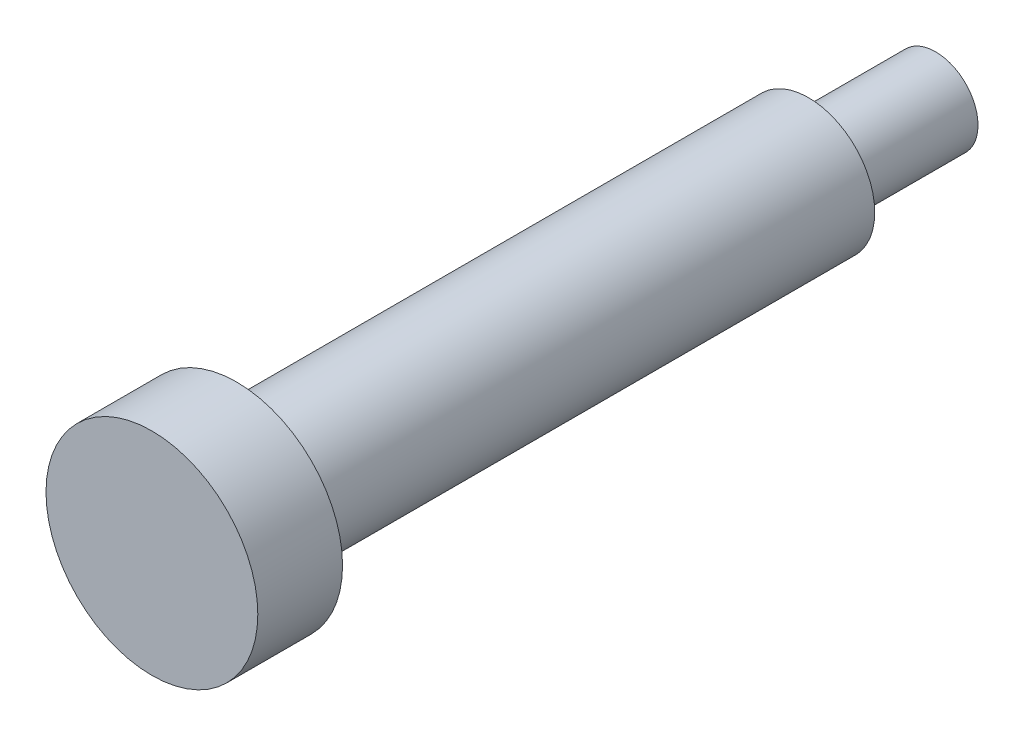
ISO-10303-21;
HEADER;
FILE_DESCRIPTION(('STEP AP214'),'2;1');
FILE_NAME('part.step','',(''),(''),'','','');
FILE_SCHEMA(('AUTOMOTIVE_DESIGN { 1 0 10303 214 1 1 1 1 }'));
ENDSEC;
DATA;
#1=APPLICATION_CONTEXT('core data for automotive mechanical design processes');
#2=APPLICATION_PROTOCOL_DEFINITION('international standard','automotive_design',2000,#1);
#3=PRODUCT_CONTEXT('',#1,'mechanical');
#4=PRODUCT('Part','Part','',(#3));
#5=PRODUCT_RELATED_PRODUCT_CATEGORY('part','',(#4));
#6=PRODUCT_DEFINITION_FORMATION('','',#4);
#7=PRODUCT_DEFINITION_CONTEXT('part definition',#1,'design');
#8=PRODUCT_DEFINITION('design','',#6,#7);
#9=PRODUCT_DEFINITION_SHAPE('','',#8);
#10=(LENGTH_UNIT() NAMED_UNIT(*) SI_UNIT(.MILLI.,.METRE.));
#11=(NAMED_UNIT(*) PLANE_ANGLE_UNIT() SI_UNIT($,.RADIAN.));
#12=(NAMED_UNIT(*) SI_UNIT($,.STERADIAN.) SOLID_ANGLE_UNIT());
#13=UNCERTAINTY_MEASURE_WITH_UNIT(LENGTH_MEASURE(1.E-05),#10,'distance_accuracy_value','');
#14=(GEOMETRIC_REPRESENTATION_CONTEXT(3) GLOBAL_UNCERTAINTY_ASSIGNED_CONTEXT((#13)) GLOBAL_UNIT_ASSIGNED_CONTEXT((#10,
#11,#12)) REPRESENTATION_CONTEXT('',''));
#15=CARTESIAN_POINT('',(0.,0.,0.));
#16=DIRECTION('',(0.,0.,1.));
#17=DIRECTION('',(1.,0.,0.));
#18=AXIS2_PLACEMENT_3D('',#15,#16,#17);
#19=CARTESIAN_POINT('',(0.,0.,4.));
#20=DIRECTION('',(0.,0.,-1.));
#21=DIRECTION('',(-1.,0.,0.));
#22=AXIS2_PLACEMENT_3D('',#19,#20,#21);
#23=CYLINDRICAL_SURFACE('',#22,5.);
#24=CARTESIAN_POINT('',(0.,0.,4.));
#25=DIRECTION('',(0.,0.,1.));
#26=DIRECTION('',(1.,0.,0.));
#27=AXIS2_PLACEMENT_3D('',#24,#25,#26);
#28=CIRCLE('',#27,5.);
#29=CARTESIAN_POINT('',(5.,0.,4.));
#30=VERTEX_POINT('',#29);
#31=EDGE_CURVE('E10',#30,#30,#28,.T.);
#32=ORIENTED_EDGE('',*,*,#31,.F.);
#33=EDGE_LOOP('',(#32));
#34=FACE_BOUND('',#33,.T.);
#35=CARTESIAN_POINT('',(0.,0.,0.));
#36=DIRECTION('',(0.,0.,1.));
#37=DIRECTION('',(1.,0.,0.));
#38=AXIS2_PLACEMENT_3D('',#35,#36,#37);
#39=CIRCLE('',#38,5.);
#40=CARTESIAN_POINT('',(5.,0.,0.));
#41=VERTEX_POINT('',#40);
#42=EDGE_CURVE('E38',#41,#41,#39,.T.);
#43=ORIENTED_EDGE('',*,*,#42,.T.);
#44=EDGE_LOOP('',(#43));
#45=FACE_BOUND('',#44,.T.);
#46=ADVANCED_FACE('F35',(#34,#45),#23,.T.);
#47=CARTESIAN_POINT('',(0.,0.,4.));
#48=DIRECTION('',(0.,0.,1.));
#49=DIRECTION('',(1.,0.,0.));
#50=AXIS2_PLACEMENT_3D('',#47,#48,#49);
#51=PLANE('',#50);
#52=ORIENTED_EDGE('',*,*,#31,.T.);
#53=EDGE_LOOP('',(#52));
#54=FACE_BOUND('',#53,.T.);
#55=ADVANCED_FACE('F71',(#54),#51,.T.);
#56=CARTESIAN_POINT('',(0.,0.,0.));
#57=DIRECTION('',(0.,0.,1.));
#58=DIRECTION('',(1.,0.,0.));
#59=AXIS2_PLACEMENT_3D('',#56,#57,#58);
#60=PLANE('',#59);
#61=CARTESIAN_POINT('',(0.,0.,0.));
#62=DIRECTION('',(0.,0.,1.));
#63=DIRECTION('',(1.,0.,0.));
#64=AXIS2_PLACEMENT_3D('',#61,#62,#63);
#65=CIRCLE('',#64,3.125);
#66=CARTESIAN_POINT('',(3.125,0.,0.));
#67=VERTEX_POINT('',#66);
#68=EDGE_CURVE('E47',#67,#67,#65,.T.);
#69=ORIENTED_EDGE('',*,*,#68,.T.);
#70=EDGE_LOOP('',(#69));
#71=FACE_BOUND('',#70,.T.);
#72=ORIENTED_EDGE('',*,*,#42,.F.);
#73=EDGE_LOOP('',(#72));
#74=FACE_BOUND('',#73,.T.);
#75=ADVANCED_FACE('F76',(#71,#74),#60,.F.);
#76=CARTESIAN_POINT('',(0.,0.,-27.));
#77=DIRECTION('',(0.,0.,1.));
#78=DIRECTION('',(1.,0.,0.));
#79=AXIS2_PLACEMENT_3D('',#76,#77,#78);
#80=CYLINDRICAL_SURFACE('',#79,3.125);
#81=CARTESIAN_POINT('',(0.,0.,-27.));
#82=DIRECTION('',(0.,0.,1.));
#83=DIRECTION('',(1.,0.,0.));
#84=AXIS2_PLACEMENT_3D('',#81,#82,#83);
#85=CIRCLE('',#84,3.125);
#86=CARTESIAN_POINT('',(3.125,0.,-27.));
#87=VERTEX_POINT('',#86);
#88=EDGE_CURVE('E45',#87,#87,#85,.T.);
#89=ORIENTED_EDGE('',*,*,#88,.T.);
#90=EDGE_LOOP('',(#89));
#91=FACE_BOUND('',#90,.T.);
#92=ORIENTED_EDGE('',*,*,#68,.F.);
#93=EDGE_LOOP('',(#92));
#94=FACE_BOUND('',#93,.T.);
#95=ADVANCED_FACE('F82',(#91,#94),#80,.T.);
#96=CARTESIAN_POINT('',(0.,0.,-27.));
#97=DIRECTION('',(0.,0.,1.));
#98=DIRECTION('',(1.,0.,0.));
#99=AXIS2_PLACEMENT_3D('',#96,#97,#98);
#100=PLANE('',#99);
#101=CARTESIAN_POINT('',(0.,0.,-27.));
#102=DIRECTION('',(0.,0.,1.));
#103=DIRECTION('',(1.,0.,0.));
#104=AXIS2_PLACEMENT_3D('',#101,#102,#103);
#105=CIRCLE('',#104,2.);
#106=CARTESIAN_POINT('',(2.,0.,-27.));
#107=VERTEX_POINT('',#106);
#108=EDGE_CURVE('E53',#107,#107,#105,.T.);
#109=ORIENTED_EDGE('',*,*,#108,.T.);
#110=EDGE_LOOP('',(#109));
#111=FACE_BOUND('',#110,.T.);
#112=ORIENTED_EDGE('',*,*,#88,.F.);
#113=EDGE_LOOP('',(#112));
#114=FACE_BOUND('',#113,.T.);
#115=ADVANCED_FACE('F68',(#111,#114),#100,.F.);
#116=CARTESIAN_POINT('',(0.,0.,-33.));
#117=DIRECTION('',(0.,0.,1.));
#118=DIRECTION('',(1.,0.,0.));
#119=AXIS2_PLACEMENT_3D('',#116,#117,#118);
#120=CYLINDRICAL_SURFACE('',#119,2.);
#121=CARTESIAN_POINT('',(0.,0.,-33.));
#122=DIRECTION('',(0.,0.,1.));
#123=DIRECTION('',(1.,0.,0.));
#124=AXIS2_PLACEMENT_3D('',#121,#122,#123);
#125=CIRCLE('',#124,2.);
#126=CARTESIAN_POINT('',(2.,0.,-33.));
#127=VERTEX_POINT('',#126);
#128=EDGE_CURVE('E50',#127,#127,#125,.T.);
#129=ORIENTED_EDGE('',*,*,#128,.T.);
#130=EDGE_LOOP('',(#129));
#131=FACE_BOUND('',#130,.T.);
#132=ORIENTED_EDGE('',*,*,#108,.F.);
#133=EDGE_LOOP('',(#132));
#134=FACE_BOUND('',#133,.T.);
#135=ADVANCED_FACE('F59',(#131,#134),#120,.T.);
#136=CARTESIAN_POINT('',(0.,0.,-33.));
#137=DIRECTION('',(0.,0.,1.));
#138=DIRECTION('',(1.,0.,0.));
#139=AXIS2_PLACEMENT_3D('',#136,#137,#138);
#140=PLANE('',#139);
#141=ORIENTED_EDGE('',*,*,#128,.F.);
#142=EDGE_LOOP('',(#141));
#143=FACE_BOUND('',#142,.T.);
#144=ADVANCED_FACE('F62',(#143),#140,.F.);
#145=CLOSED_SHELL('',(#46,#55,#75,#95,#115,#135,#144));
#146=MANIFOLD_SOLID_BREP('B2',#145);
#147=ADVANCED_BREP_SHAPE_REPRESENTATION('',(#18,#146),#14);
#148=SHAPE_DEFINITION_REPRESENTATION(#9,#147);
ENDSEC;
END-ISO-10303-21;
